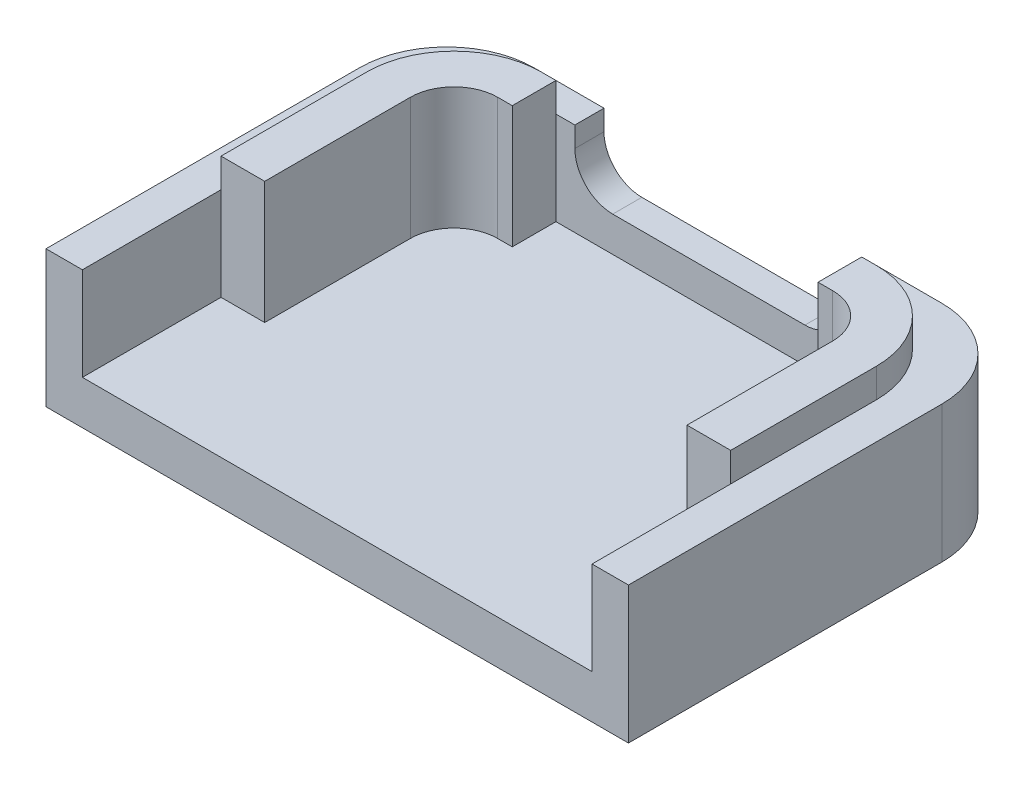
ISO-10303-21;
HEADER;
FILE_DESCRIPTION(('STEP AP214'),'2;1');
FILE_NAME('part.step','',(''),(''),'','','');
FILE_SCHEMA(('AUTOMOTIVE_DESIGN { 1 0 10303 214 1 1 1 1 }'));
ENDSEC;
DATA;
#1=APPLICATION_CONTEXT('core data for automotive mechanical design processes');
#2=APPLICATION_PROTOCOL_DEFINITION('international standard','automotive_design',2000,#1);
#3=PRODUCT_CONTEXT('',#1,'mechanical');
#4=PRODUCT('Part','Part','',(#3));
#5=PRODUCT_RELATED_PRODUCT_CATEGORY('part','',(#4));
#6=PRODUCT_DEFINITION_FORMATION('','',#4);
#7=PRODUCT_DEFINITION_CONTEXT('part definition',#1,'design');
#8=PRODUCT_DEFINITION('design','',#6,#7);
#9=PRODUCT_DEFINITION_SHAPE('','',#8);
#10=(LENGTH_UNIT() NAMED_UNIT(*) SI_UNIT(.MILLI.,.METRE.));
#11=(NAMED_UNIT(*) PLANE_ANGLE_UNIT() SI_UNIT($,.RADIAN.));
#12=(NAMED_UNIT(*) SI_UNIT($,.STERADIAN.) SOLID_ANGLE_UNIT());
#13=UNCERTAINTY_MEASURE_WITH_UNIT(LENGTH_MEASURE(1.E-05),#10,'distance_accuracy_value','');
#14=(GEOMETRIC_REPRESENTATION_CONTEXT(3) GLOBAL_UNCERTAINTY_ASSIGNED_CONTEXT((#13)) GLOBAL_UNIT_ASSIGNED_CONTEXT((#10,
#11,#12)) REPRESENTATION_CONTEXT('',''));
#15=CARTESIAN_POINT('',(0.,0.,0.));
#16=DIRECTION('',(0.,0.,1.));
#17=DIRECTION('',(1.,0.,0.));
#18=AXIS2_PLACEMENT_3D('',#15,#16,#17);
#19=CARTESIAN_POINT('',(1.49999999999999,3.2,-20.46));
#20=DIRECTION('',(0.,1.,0.));
#21=DIRECTION('',(0.,0.,1.));
#22=AXIS2_PLACEMENT_3D('',#19,#20,#21);
#23=PLANE('',#22);
#24=DIRECTION('',(0.,0.,-1.));
#25=VECTOR('',#24,1.);
#26=CARTESIAN_POINT('',(13.1,3.2,-20.46));
#27=LINE('',#26,#25);
#28=CARTESIAN_POINT('',(13.1,3.2,-22.46));
#29=VERTEX_POINT('',#28);
#30=CARTESIAN_POINT('',(13.1,3.2,-23.46));
#31=VERTEX_POINT('',#30);
#32=EDGE_CURVE('E11',#29,#31,#27,.T.);
#33=ORIENTED_EDGE('',*,*,#32,.F.);
#34=DIRECTION('',(1.,0.,0.));
#35=VECTOR('',#34,1.);
#36=CARTESIAN_POINT('',(2.74999999999999,3.2,-22.46));
#37=LINE('',#36,#35);
#38=CARTESIAN_POINT('',(13.75,3.2,-22.46));
#39=VERTEX_POINT('',#38);
#40=EDGE_CURVE('E486',#29,#39,#37,.T.);
#41=ORIENTED_EDGE('',*,*,#40,.T.);
#42=CARTESIAN_POINT('',(14.25,3.2,-22.46));
#43=VERTEX_POINT('',#42);
#44=EDGE_CURVE('E479',#39,#43,#37,.T.);
#45=ORIENTED_EDGE('',*,*,#44,.T.);
#46=CARTESIAN_POINT('',(14.25,3.2,-19.46));
#47=DIRECTION('',(0.,-1.,0.));
#48=DIRECTION('',(0.,0.,1.));
#49=AXIS2_PLACEMENT_3D('',#46,#47,#48);
#50=CIRCLE('',#49,3.);
#51=CARTESIAN_POINT('',(17.25,3.2,-19.46));
#52=VERTEX_POINT('',#51);
#53=EDGE_CURVE('E484',#43,#52,#50,.T.);
#54=ORIENTED_EDGE('',*,*,#53,.T.);
#55=DIRECTION('',(0.,0.,1.));
#56=VECTOR('',#55,1.);
#57=CARTESIAN_POINT('',(17.25,3.2,-19.46));
#58=LINE('',#57,#56);
#59=CARTESIAN_POINT('',(17.25,3.2,-14.46));
#60=VERTEX_POINT('',#59);
#61=EDGE_CURVE('E491',#52,#60,#58,.T.);
#62=ORIENTED_EDGE('',*,*,#61,.T.);
#63=CARTESIAN_POINT('',(17.25,3.2,-9.7));
#64=VERTEX_POINT('',#63);
#65=EDGE_CURVE('E490',#60,#64,#58,.T.);
#66=ORIENTED_EDGE('',*,*,#65,.T.);
#67=DIRECTION('',(1.,0.,0.));
#68=VECTOR('',#67,1.);
#69=CARTESIAN_POINT('',(18.5,3.2,-9.7));
#70=LINE('',#69,#68);
#71=CARTESIAN_POINT('',(18.5,3.2,-9.7));
#72=VERTEX_POINT('',#71);
#73=EDGE_CURVE('E495',#64,#72,#70,.T.);
#74=ORIENTED_EDGE('',*,*,#73,.T.);
#75=DIRECTION('',(0.,0.,-1.));
#76=VECTOR('',#75,1.);
#77=CARTESIAN_POINT('',(18.5,3.2,-20.46));
#78=LINE('',#77,#76);
#79=CARTESIAN_POINT('',(18.5,3.2,-20.46));
#80=VERTEX_POINT('',#79);
#81=EDGE_CURVE('E499',#72,#80,#78,.T.);
#82=ORIENTED_EDGE('',*,*,#81,.T.);
#83=CARTESIAN_POINT('',(15.5,3.2,-20.46));
#84=DIRECTION('',(0.,1.,0.));
#85=DIRECTION('',(0.,0.,-1.));
#86=AXIS2_PLACEMENT_3D('',#83,#84,#85);
#87=CIRCLE('',#86,3.);
#88=CARTESIAN_POINT('',(15.5,3.2,-23.46));
#89=VERTEX_POINT('',#88);
#90=EDGE_CURVE('E503',#80,#89,#87,.T.);
#91=ORIENTED_EDGE('',*,*,#90,.T.);
#92=DIRECTION('',(-1.,0.,0.));
#93=VECTOR('',#92,1.);
#94=CARTESIAN_POINT('',(1.50000000000001,3.2,-23.46));
#95=LINE('',#94,#93);
#96=EDGE_CURVE('E508',#89,#31,#95,.T.);
#97=ORIENTED_EDGE('',*,*,#96,.T.);
#98=EDGE_LOOP('',(#33,#41,#45,#54,#62,#66,#74,#82,#91,#97));
#99=FACE_BOUND('',#98,.T.);
#100=ADVANCED_FACE('F45',(#99),#23,.T.);
#101=CARTESIAN_POINT('',(15.5,0.,-20.46));
#102=DIRECTION('',(0.,-1.,0.));
#103=DIRECTION('',(0.,0.,-1.));
#104=AXIS2_PLACEMENT_3D('',#101,#102,#103);
#105=PLANE('',#104);
#106=DIRECTION('',(1.,0.,0.));
#107=VECTOR('',#106,1.);
#108=CARTESIAN_POINT('',(15.75,0.,-14.46));
#109=LINE('',#108,#107);
#110=CARTESIAN_POINT('',(15.75,0.,-14.46));
#111=VERTEX_POINT('',#110);
#112=CARTESIAN_POINT('',(17.25,0.,-14.46));
#113=VERTEX_POINT('',#112);
#114=EDGE_CURVE('E359',#111,#113,#109,.T.);
#115=ORIENTED_EDGE('',*,*,#114,.F.);
#116=DIRECTION('',(0.,0.,1.));
#117=VECTOR('',#116,1.);
#118=CARTESIAN_POINT('',(15.75,0.,-19.46));
#119=LINE('',#118,#117);
#120=CARTESIAN_POINT('',(15.75,0.,-19.46));
#121=VERTEX_POINT('',#120);
#122=EDGE_CURVE('E362',#121,#111,#119,.T.);
#123=ORIENTED_EDGE('',*,*,#122,.F.);
#124=CARTESIAN_POINT('',(14.25,0.,-19.46));
#125=DIRECTION('',(0.,-1.,0.));
#126=DIRECTION('',(0.,0.,1.));
#127=AXIS2_PLACEMENT_3D('',#124,#125,#126);
#128=CIRCLE('',#127,1.5);
#129=CARTESIAN_POINT('',(14.25,0.,-20.96));
#130=VERTEX_POINT('',#129);
#131=EDGE_CURVE('E365',#130,#121,#128,.T.);
#132=ORIENTED_EDGE('',*,*,#131,.F.);
#133=DIRECTION('',(1.,0.,0.));
#134=VECTOR('',#133,1.);
#135=CARTESIAN_POINT('',(13.75,0.,-20.96));
#136=LINE('',#135,#134);
#137=CARTESIAN_POINT('',(13.75,0.,-20.96));
#138=VERTEX_POINT('',#137);
#139=EDGE_CURVE('E352',#138,#130,#136,.T.);
#140=ORIENTED_EDGE('',*,*,#139,.F.);
#141=DIRECTION('',(0.,0.,1.));
#142=VECTOR('',#141,1.);
#143=CARTESIAN_POINT('',(13.75,0.,-20.96));
#144=LINE('',#143,#142);
#145=CARTESIAN_POINT('',(13.75,0.,-22.46));
#146=VERTEX_POINT('',#145);
#147=EDGE_CURVE('E355',#146,#138,#144,.T.);
#148=ORIENTED_EDGE('',*,*,#147,.F.);
#149=DIRECTION('',(1.,0.,0.));
#150=VECTOR('',#149,1.);
#151=CARTESIAN_POINT('',(2.74999999999999,0.,-22.46));
#152=LINE('',#151,#150);
#153=CARTESIAN_POINT('',(3.25,0.,-22.46));
#154=VERTEX_POINT('',#153);
#155=EDGE_CURVE('E523',#154,#146,#152,.T.);
#156=ORIENTED_EDGE('',*,*,#155,.F.);
#157=DIRECTION('',(0.,0.,-1.));
#158=VECTOR('',#157,1.);
#159=CARTESIAN_POINT('',(3.25,0.,-20.96));
#160=LINE('',#159,#158);
#161=CARTESIAN_POINT('',(3.25,0.,-20.96));
#162=VERTEX_POINT('',#161);
#163=EDGE_CURVE('E426',#162,#154,#160,.T.);
#164=ORIENTED_EDGE('',*,*,#163,.F.);
#165=DIRECTION('',(1.,0.,0.));
#166=VECTOR('',#165,1.);
#167=CARTESIAN_POINT('',(2.75,0.,-20.96));
#168=LINE('',#167,#166);
#169=CARTESIAN_POINT('',(2.75,0.,-20.96));
#170=VERTEX_POINT('',#169);
#171=EDGE_CURVE('E423',#170,#162,#168,.T.);
#172=ORIENTED_EDGE('',*,*,#171,.F.);
#173=CARTESIAN_POINT('',(2.75,0.,-19.46));
#174=DIRECTION('',(0.,-1.,0.));
#175=DIRECTION('',(0.,0.,-1.));
#176=AXIS2_PLACEMENT_3D('',#173,#174,#175);
#177=CIRCLE('',#176,1.5);
#178=CARTESIAN_POINT('',(1.25,0.,-19.46));
#179=VERTEX_POINT('',#178);
#180=EDGE_CURVE('E369',#179,#170,#177,.T.);
#181=ORIENTED_EDGE('',*,*,#180,.F.);
#182=DIRECTION('',(0.,0.,-1.));
#183=VECTOR('',#182,1.);
#184=CARTESIAN_POINT('',(1.25,0.,-19.46));
#185=LINE('',#184,#183);
#186=CARTESIAN_POINT('',(1.25,0.,-14.46));
#187=VERTEX_POINT('',#186);
#188=EDGE_CURVE('E398',#187,#179,#185,.T.);
#189=ORIENTED_EDGE('',*,*,#188,.F.);
#190=DIRECTION('',(1.,0.,0.));
#191=VECTOR('',#190,1.);
#192=CARTESIAN_POINT('',(-0.250000000000002,0.,-14.46));
#193=LINE('',#192,#191);
#194=CARTESIAN_POINT('',(-0.250000000000002,0.,-14.46));
#195=VERTEX_POINT('',#194);
#196=EDGE_CURVE('E429',#195,#187,#193,.T.);
#197=ORIENTED_EDGE('',*,*,#196,.F.);
#198=DIRECTION('',(0.,0.,-1.));
#199=VECTOR('',#198,1.);
#200=CARTESIAN_POINT('',(-0.250000000000006,0.,-19.46));
#201=LINE('',#200,#199);
#202=CARTESIAN_POINT('',(-0.250000000000006,0.,-9.7));
#203=VERTEX_POINT('',#202);
#204=EDGE_CURVE('E465',#203,#195,#201,.T.);
#205=ORIENTED_EDGE('',*,*,#204,.F.);
#206=DIRECTION('',(1.,0.,0.));
#207=VECTOR('',#206,1.);
#208=CARTESIAN_POINT('',(-1.50000000000001,0.,-9.7));
#209=LINE('',#208,#207);
#210=CARTESIAN_POINT('',(17.25,0.,-9.7));
#211=VERTEX_POINT('',#210);
#212=EDGE_CURVE('E536',#203,#211,#209,.T.);
#213=ORIENTED_EDGE('',*,*,#212,.T.);
#214=DIRECTION('',(0.,0.,1.));
#215=VECTOR('',#214,1.);
#216=CARTESIAN_POINT('',(17.25,0.,-19.46));
#217=LINE('',#216,#215);
#218=EDGE_CURVE('E69',#113,#211,#217,.T.);
#219=ORIENTED_EDGE('',*,*,#218,.F.);
#220=EDGE_LOOP('',(#115,#123,#132,#140,#148,#156,#164,#172,#181,#189,#197,#205,#213,#219));
#221=FACE_BOUND('',#220,.T.);
#222=ADVANCED_FACE('F620',(#221),#105,.F.);
#223=CARTESIAN_POINT('',(2.74999999999999,3.2,-22.46));
#224=DIRECTION('',(0.,0.,-1.));
#225=DIRECTION('',(-1.,0.,0.));
#226=AXIS2_PLACEMENT_3D('',#223,#224,#225);
#227=PLANE('',#226);
#228=ORIENTED_EDGE('',*,*,#40,.F.);
#229=DIRECTION('',(0.,-1.,0.));
#230=VECTOR('',#229,1.);
#231=CARTESIAN_POINT('',(13.1,3.2,-22.46));
#232=LINE('',#231,#230);
#233=CARTESIAN_POINT('',(13.1,2.5,-22.46));
#234=VERTEX_POINT('',#233);
#235=EDGE_CURVE('E306',#29,#234,#232,.T.);
#236=ORIENTED_EDGE('',*,*,#235,.T.);
#237=CARTESIAN_POINT('',(11.8,2.5,-22.46));
#238=DIRECTION('',(0.,0.,-1.));
#239=DIRECTION('',(-1.,0.,0.));
#240=AXIS2_PLACEMENT_3D('',#237,#238,#239);
#241=CIRCLE('',#240,1.3);
#242=CARTESIAN_POINT('',(11.8,1.2,-22.46));
#243=VERTEX_POINT('',#242);
#244=EDGE_CURVE('E264',#234,#243,#241,.T.);
#245=ORIENTED_EDGE('',*,*,#244,.T.);
#246=DIRECTION('',(-1.,0.,0.));
#247=VECTOR('',#246,1.);
#248=CARTESIAN_POINT('',(2.74999999999999,1.2,-22.46));
#249=LINE('',#248,#247);
#250=CARTESIAN_POINT('',(5.2,1.2,-22.46));
#251=VERTEX_POINT('',#250);
#252=EDGE_CURVE('E311',#243,#251,#249,.T.);
#253=ORIENTED_EDGE('',*,*,#252,.T.);
#254=CARTESIAN_POINT('',(5.2,2.5,-22.46));
#255=DIRECTION('',(0.,0.,-1.));
#256=DIRECTION('',(-1.,0.,0.));
#257=AXIS2_PLACEMENT_3D('',#254,#255,#256);
#258=CIRCLE('',#257,1.3);
#259=CARTESIAN_POINT('',(3.9,2.5,-22.46));
#260=VERTEX_POINT('',#259);
#261=EDGE_CURVE('E315',#251,#260,#258,.T.);
#262=ORIENTED_EDGE('',*,*,#261,.T.);
#263=DIRECTION('',(0.,1.,0.));
#264=VECTOR('',#263,1.);
#265=CARTESIAN_POINT('',(3.9,3.2,-22.46));
#266=LINE('',#265,#264);
#267=CARTESIAN_POINT('',(3.9,3.2,-22.46));
#268=VERTEX_POINT('',#267);
#269=EDGE_CURVE('E297',#260,#268,#266,.T.);
#270=ORIENTED_EDGE('',*,*,#269,.T.);
#271=CARTESIAN_POINT('',(3.25,3.2,-22.46));
#272=VERTEX_POINT('',#271);
#273=EDGE_CURVE('E485',#272,#268,#37,.T.);
#274=ORIENTED_EDGE('',*,*,#273,.F.);
#275=DIRECTION('',(0.,-1.,0.));
#276=VECTOR('',#275,1.);
#277=CARTESIAN_POINT('',(3.25,4.2,-22.46));
#278=LINE('',#277,#276);
#279=EDGE_CURVE('E453',#272,#154,#278,.T.);
#280=ORIENTED_EDGE('',*,*,#279,.T.);
#281=ORIENTED_EDGE('',*,*,#155,.T.);
#282=DIRECTION('',(0.,-1.,0.));
#283=VECTOR('',#282,1.);
#284=CARTESIAN_POINT('',(13.75,4.2,-22.46));
#285=LINE('',#284,#283);
#286=EDGE_CURVE('E338',#39,#146,#285,.T.);
#287=ORIENTED_EDGE('',*,*,#286,.F.);
#288=EDGE_LOOP('',(#228,#236,#245,#253,#262,#270,#274,#280,#281,#287));
#289=FACE_BOUND('',#288,.T.);
#290=ADVANCED_FACE('F590',(#289),#227,.F.);
#291=CARTESIAN_POINT('',(17.25,3.2,-19.46));
#292=DIRECTION('',(1.,0.,0.));
#293=DIRECTION('',(0.,0.,-1.));
#294=AXIS2_PLACEMENT_3D('',#291,#292,#293);
#295=PLANE('',#294);
#296=DIRECTION('',(0.,-1.,0.));
#297=VECTOR('',#296,1.);
#298=CARTESIAN_POINT('',(17.25,4.2,-14.46));
#299=LINE('',#298,#297);
#300=EDGE_CURVE('E326',#60,#113,#299,.T.);
#301=ORIENTED_EDGE('',*,*,#300,.T.);
#302=ORIENTED_EDGE('',*,*,#218,.T.);
#303=DIRECTION('',(0.,-1.,0.));
#304=VECTOR('',#303,1.);
#305=CARTESIAN_POINT('',(17.25,3.2,-9.7));
#306=LINE('',#305,#304);
#307=EDGE_CURVE('E519',#64,#211,#306,.T.);
#308=ORIENTED_EDGE('',*,*,#307,.F.);
#309=ORIENTED_EDGE('',*,*,#65,.F.);
#310=EDGE_LOOP('',(#301,#302,#308,#309));
#311=FACE_BOUND('',#310,.T.);
#312=ADVANCED_FACE('F615',(#311),#295,.F.);
#313=CARTESIAN_POINT('',(-0.250000000000006,3.2,-19.46));
#314=DIRECTION('',(-1.,0.,0.));
#315=DIRECTION('',(0.,0.,1.));
#316=AXIS2_PLACEMENT_3D('',#313,#314,#315);
#317=PLANE('',#316);
#318=DIRECTION('',(0.,-1.,0.));
#319=VECTOR('',#318,1.);
#320=CARTESIAN_POINT('',(-0.250000000000002,4.2,-14.46));
#321=LINE('',#320,#319);
#322=CARTESIAN_POINT('',(-0.250000000000002,3.2,-14.46));
#323=VERTEX_POINT('',#322);
#324=EDGE_CURVE('E441',#323,#195,#321,.T.);
#325=ORIENTED_EDGE('',*,*,#324,.F.);
#326=DIRECTION('',(0.,0.,-1.));
#327=VECTOR('',#326,1.);
#328=CARTESIAN_POINT('',(-0.250000000000006,3.2,-19.46));
#329=LINE('',#328,#327);
#330=CARTESIAN_POINT('',(-0.250000000000005,3.2,-9.7));
#331=VERTEX_POINT('',#330);
#332=EDGE_CURVE('E471',#331,#323,#329,.T.);
#333=ORIENTED_EDGE('',*,*,#332,.F.);
#334=DIRECTION('',(0.,-1.,0.));
#335=VECTOR('',#334,1.);
#336=CARTESIAN_POINT('',(-0.250000000000005,3.2,-9.7));
#337=LINE('',#336,#335);
#338=EDGE_CURVE('E532',#331,#203,#337,.T.);
#339=ORIENTED_EDGE('',*,*,#338,.T.);
#340=ORIENTED_EDGE('',*,*,#204,.T.);
#341=EDGE_LOOP('',(#325,#333,#339,#340));
#342=FACE_BOUND('',#341,.T.);
#343=ADVANCED_FACE('F651',(#342),#317,.F.);
#344=CARTESIAN_POINT('',(-1.50000000000001,-1.5,-9.7));
#345=DIRECTION('',(0.,0.,1.));
#346=DIRECTION('',(1.,0.,0.));
#347=AXIS2_PLACEMENT_3D('',#344,#345,#346);
#348=PLANE('',#347);
#349=ORIENTED_EDGE('',*,*,#212,.F.);
#350=ORIENTED_EDGE('',*,*,#338,.F.);
#351=DIRECTION('',(1.,0.,0.));
#352=VECTOR('',#351,1.);
#353=CARTESIAN_POINT('',(-0.250000000000005,3.2,-9.7));
#354=LINE('',#353,#352);
#355=CARTESIAN_POINT('',(-1.50000000000001,3.2,-9.7));
#356=VERTEX_POINT('',#355);
#357=EDGE_CURVE('E466',#356,#331,#354,.T.);
#358=ORIENTED_EDGE('',*,*,#357,.F.);
#359=DIRECTION('',(0.,1.,0.));
#360=VECTOR('',#359,1.);
#361=CARTESIAN_POINT('',(-1.50000000000001,-1.5,-9.7));
#362=LINE('',#361,#360);
#363=CARTESIAN_POINT('',(-1.50000000000001,-1.5,-9.7));
#364=VERTEX_POINT('',#363);
#365=EDGE_CURVE('E564',#364,#356,#362,.T.);
#366=ORIENTED_EDGE('',*,*,#365,.F.);
#367=DIRECTION('',(1.,0.,0.));
#368=VECTOR('',#367,1.);
#369=CARTESIAN_POINT('',(-1.50000000000001,-1.5,-9.7));
#370=LINE('',#369,#368);
#371=CARTESIAN_POINT('',(18.5,-1.5,-9.7));
#372=VERTEX_POINT('',#371);
#373=EDGE_CURVE('E537',#364,#372,#370,.T.);
#374=ORIENTED_EDGE('',*,*,#373,.T.);
#375=DIRECTION('',(0.,1.,0.));
#376=VECTOR('',#375,1.);
#377=CARTESIAN_POINT('',(18.5,-1.5,-9.7));
#378=LINE('',#377,#376);
#379=EDGE_CURVE('E561',#372,#72,#378,.T.);
#380=ORIENTED_EDGE('',*,*,#379,.T.);
#381=ORIENTED_EDGE('',*,*,#73,.F.);
#382=ORIENTED_EDGE('',*,*,#307,.T.);
#383=EDGE_LOOP('',(#349,#350,#358,#366,#374,#380,#381,#382));
#384=FACE_BOUND('',#383,.T.);
#385=ADVANCED_FACE('F47',(#384),#348,.T.);
#386=CARTESIAN_POINT('',(-1.50000000000001,-1.5,-20.46));
#387=DIRECTION('',(-1.,0.,0.));
#388=DIRECTION('',(0.,0.,1.));
#389=AXIS2_PLACEMENT_3D('',#386,#387,#388);
#390=PLANE('',#389);
#391=ORIENTED_EDGE('',*,*,#365,.T.);
#392=DIRECTION('',(0.,0.,1.));
#393=VECTOR('',#392,1.);
#394=CARTESIAN_POINT('',(-1.50000000000001,3.2,-20.46));
#395=LINE('',#394,#393);
#396=CARTESIAN_POINT('',(-1.50000000000001,3.2,-20.46));
#397=VERTEX_POINT('',#396);
#398=EDGE_CURVE('E515',#397,#356,#395,.T.);
#399=ORIENTED_EDGE('',*,*,#398,.F.);
#400=DIRECTION('',(0.,1.,0.));
#401=VECTOR('',#400,1.);
#402=CARTESIAN_POINT('',(-1.50000000000001,-1.5,-20.46));
#403=LINE('',#402,#401);
#404=CARTESIAN_POINT('',(-1.50000000000001,-1.5,-20.46));
#405=VERTEX_POINT('',#404);
#406=EDGE_CURVE('E567',#405,#397,#403,.T.);
#407=ORIENTED_EDGE('',*,*,#406,.F.);
#408=DIRECTION('',(0.,0.,1.));
#409=VECTOR('',#408,1.);
#410=CARTESIAN_POINT('',(-1.50000000000001,-1.5,-20.46));
#411=LINE('',#410,#409);
#412=EDGE_CURVE('E557',#405,#364,#411,.T.);
#413=ORIENTED_EDGE('',*,*,#412,.T.);
#414=EDGE_LOOP('',(#391,#399,#407,#413));
#415=FACE_BOUND('',#414,.T.);
#416=ADVANCED_FACE('F647',(#415),#390,.T.);
#417=CARTESIAN_POINT('',(1.49999999999999,-1.5,-20.46));
#418=DIRECTION('',(0.,1.,0.));
#419=DIRECTION('',(0.,0.,1.));
#420=AXIS2_PLACEMENT_3D('',#417,#418,#419);
#421=CYLINDRICAL_SURFACE('',#420,3.);
#422=ORIENTED_EDGE('',*,*,#406,.T.);
#423=CARTESIAN_POINT('',(1.49999999999999,3.2,-20.46));
#424=DIRECTION('',(0.,1.,0.));
#425=DIRECTION('',(0.,0.,1.));
#426=AXIS2_PLACEMENT_3D('',#423,#424,#425);
#427=CIRCLE('',#426,3.);
#428=CARTESIAN_POINT('',(1.50000000000001,3.2,-23.46));
#429=VERTEX_POINT('',#428);
#430=EDGE_CURVE('E511',#429,#397,#427,.T.);
#431=ORIENTED_EDGE('',*,*,#430,.F.);
#432=DIRECTION('',(0.,1.,0.));
#433=VECTOR('',#432,1.);
#434=CARTESIAN_POINT('',(1.50000000000001,-1.5,-23.46));
#435=LINE('',#434,#433);
#436=CARTESIAN_POINT('',(1.50000000000001,-1.5,-23.46));
#437=VERTEX_POINT('',#436);
#438=EDGE_CURVE('E570',#437,#429,#435,.T.);
#439=ORIENTED_EDGE('',*,*,#438,.F.);
#440=CARTESIAN_POINT('',(1.49999999999999,-1.5,-20.46));
#441=DIRECTION('',(0.,1.,0.));
#442=DIRECTION('',(0.,0.,1.));
#443=AXIS2_PLACEMENT_3D('',#440,#441,#442);
#444=CIRCLE('',#443,3.);
#445=EDGE_CURVE('E553',#437,#405,#444,.T.);
#446=ORIENTED_EDGE('',*,*,#445,.T.);
#447=EDGE_LOOP('',(#422,#431,#439,#446));
#448=FACE_BOUND('',#447,.T.);
#449=ADVANCED_FACE('F643',(#448),#421,.T.);
#450=CARTESIAN_POINT('',(1.50000000000001,-1.5,-23.46));
#451=DIRECTION('',(0.,0.,-1.));
#452=DIRECTION('',(-1.,0.,0.));
#453=AXIS2_PLACEMENT_3D('',#450,#451,#452);
#454=PLANE('',#453);
#455=DIRECTION('',(0.,-1.,0.));
#456=VECTOR('',#455,1.);
#457=CARTESIAN_POINT('',(13.1,3.2,-23.46));
#458=LINE('',#457,#456);
#459=CARTESIAN_POINT('',(13.1,2.5,-23.46));
#460=VERTEX_POINT('',#459);
#461=EDGE_CURVE('E271',#31,#460,#458,.T.);
#462=ORIENTED_EDGE('',*,*,#461,.F.);
#463=ORIENTED_EDGE('',*,*,#96,.F.);
#464=DIRECTION('',(0.,1.,0.));
#465=VECTOR('',#464,1.);
#466=CARTESIAN_POINT('',(15.5,-1.5,-23.46));
#467=LINE('',#466,#465);
#468=CARTESIAN_POINT('',(15.5,-1.5,-23.46));
#469=VERTEX_POINT('',#468);
#470=EDGE_CURVE('E574',#469,#89,#467,.T.);
#471=ORIENTED_EDGE('',*,*,#470,.F.);
#472=DIRECTION('',(-1.,0.,0.));
#473=VECTOR('',#472,1.);
#474=CARTESIAN_POINT('',(1.50000000000001,-1.5,-23.46));
#475=LINE('',#474,#473);
#476=EDGE_CURVE('E549',#469,#437,#475,.T.);
#477=ORIENTED_EDGE('',*,*,#476,.T.);
#478=ORIENTED_EDGE('',*,*,#438,.T.);
#479=CARTESIAN_POINT('',(3.9,3.2,-23.46));
#480=VERTEX_POINT('',#479);
#481=EDGE_CURVE('E507',#480,#429,#95,.T.);
#482=ORIENTED_EDGE('',*,*,#481,.F.);
#483=DIRECTION('',(0.,1.,0.));
#484=VECTOR('',#483,1.);
#485=CARTESIAN_POINT('',(3.9,3.2,-23.46));
#486=LINE('',#485,#484);
#487=CARTESIAN_POINT('',(3.9,2.5,-23.46));
#488=VERTEX_POINT('',#487);
#489=EDGE_CURVE('E61',#488,#480,#486,.T.);
#490=ORIENTED_EDGE('',*,*,#489,.F.);
#491=CARTESIAN_POINT('',(5.2,2.5,-23.46));
#492=DIRECTION('',(0.,0.,-1.));
#493=DIRECTION('',(-1.,0.,0.));
#494=AXIS2_PLACEMENT_3D('',#491,#492,#493);
#495=CIRCLE('',#494,1.3);
#496=CARTESIAN_POINT('',(5.2,1.2,-23.46));
#497=VERTEX_POINT('',#496);
#498=EDGE_CURVE('E286',#497,#488,#495,.T.);
#499=ORIENTED_EDGE('',*,*,#498,.F.);
#500=DIRECTION('',(-1.,0.,0.));
#501=VECTOR('',#500,1.);
#502=CARTESIAN_POINT('',(11.8,1.2,-23.46));
#503=LINE('',#502,#501);
#504=CARTESIAN_POINT('',(11.8,1.2,-23.46));
#505=VERTEX_POINT('',#504);
#506=EDGE_CURVE('E282',#505,#497,#503,.T.);
#507=ORIENTED_EDGE('',*,*,#506,.F.);
#508=CARTESIAN_POINT('',(11.8,2.5,-23.46));
#509=DIRECTION('',(0.,0.,-1.));
#510=DIRECTION('',(-1.,0.,0.));
#511=AXIS2_PLACEMENT_3D('',#508,#509,#510);
#512=CIRCLE('',#511,1.3);
#513=EDGE_CURVE('E261',#460,#505,#512,.T.);
#514=ORIENTED_EDGE('',*,*,#513,.F.);
#515=EDGE_LOOP('',(#462,#463,#471,#477,#478,#482,#490,#499,#507,#514));
#516=FACE_BOUND('',#515,.T.);
#517=ADVANCED_FACE('F279',(#516),#454,.T.);
#518=CARTESIAN_POINT('',(15.5,-1.5,-20.46));
#519=DIRECTION('',(0.,1.,0.));
#520=DIRECTION('',(0.,0.,1.));
#521=AXIS2_PLACEMENT_3D('',#518,#519,#520);
#522=CYLINDRICAL_SURFACE('',#521,3.);
#523=ORIENTED_EDGE('',*,*,#470,.T.);
#524=ORIENTED_EDGE('',*,*,#90,.F.);
#525=DIRECTION('',(0.,1.,0.));
#526=VECTOR('',#525,1.);
#527=CARTESIAN_POINT('',(18.5,-1.5,-20.46));
#528=LINE('',#527,#526);
#529=CARTESIAN_POINT('',(18.5,-1.5,-20.46));
#530=VERTEX_POINT('',#529);
#531=EDGE_CURVE('E577',#530,#80,#528,.T.);
#532=ORIENTED_EDGE('',*,*,#531,.F.);
#533=CARTESIAN_POINT('',(15.5,-1.5,-20.46));
#534=DIRECTION('',(0.,1.,0.));
#535=DIRECTION('',(0.,0.,-1.));
#536=AXIS2_PLACEMENT_3D('',#533,#534,#535);
#537=CIRCLE('',#536,3.);
#538=EDGE_CURVE('E545',#530,#469,#537,.T.);
#539=ORIENTED_EDGE('',*,*,#538,.T.);
#540=EDGE_LOOP('',(#523,#524,#532,#539));
#541=FACE_BOUND('',#540,.T.);
#542=ADVANCED_FACE('F634',(#541),#522,.T.);
#543=CARTESIAN_POINT('',(18.5,-1.5,-20.46));
#544=DIRECTION('',(1.,0.,0.));
#545=DIRECTION('',(0.,0.,-1.));
#546=AXIS2_PLACEMENT_3D('',#543,#544,#545);
#547=PLANE('',#546);
#548=ORIENTED_EDGE('',*,*,#531,.T.);
#549=ORIENTED_EDGE('',*,*,#81,.F.);
#550=ORIENTED_EDGE('',*,*,#379,.F.);
#551=DIRECTION('',(0.,0.,-1.));
#552=VECTOR('',#551,1.);
#553=CARTESIAN_POINT('',(18.5,-1.5,-20.46));
#554=LINE('',#553,#552);
#555=EDGE_CURVE('E541',#372,#530,#554,.T.);
#556=ORIENTED_EDGE('',*,*,#555,.T.);
#557=EDGE_LOOP('',(#548,#549,#550,#556));
#558=FACE_BOUND('',#557,.T.);
#559=ADVANCED_FACE('F630',(#558),#547,.T.);
#560=CARTESIAN_POINT('',(15.5,-1.5,-20.46));
#561=DIRECTION('',(0.,-1.,0.));
#562=DIRECTION('',(0.,0.,-1.));
#563=AXIS2_PLACEMENT_3D('',#560,#561,#562);
#564=PLANE('',#563);
#565=ORIENTED_EDGE('',*,*,#373,.F.);
#566=ORIENTED_EDGE('',*,*,#412,.F.);
#567=ORIENTED_EDGE('',*,*,#445,.F.);
#568=ORIENTED_EDGE('',*,*,#476,.F.);
#569=ORIENTED_EDGE('',*,*,#538,.F.);
#570=ORIENTED_EDGE('',*,*,#555,.F.);
#571=EDGE_LOOP('',(#565,#566,#567,#568,#569,#570));
#572=FACE_BOUND('',#571,.T.);
#573=ADVANCED_FACE('F638',(#572),#564,.T.);
#574=DIRECTION('',(0.,0.,1.));
#575=VECTOR('',#574,1.);
#576=CARTESIAN_POINT('',(3.9,3.2,-20.46));
#577=LINE('',#576,#575);
#578=EDGE_CURVE('E54',#480,#268,#577,.T.);
#579=ORIENTED_EDGE('',*,*,#578,.F.);
#580=ORIENTED_EDGE('',*,*,#481,.T.);
#581=ORIENTED_EDGE('',*,*,#430,.T.);
#582=ORIENTED_EDGE('',*,*,#398,.T.);
#583=ORIENTED_EDGE('',*,*,#357,.T.);
#584=ORIENTED_EDGE('',*,*,#332,.T.);
#585=CARTESIAN_POINT('',(-0.250000000000006,3.2,-19.46));
#586=VERTEX_POINT('',#585);
#587=EDGE_CURVE('E470',#323,#586,#329,.T.);
#588=ORIENTED_EDGE('',*,*,#587,.T.);
#589=CARTESIAN_POINT('',(2.74999999999999,3.2,-19.46));
#590=DIRECTION('',(0.,-1.,0.));
#591=DIRECTION('',(0.,0.,-1.));
#592=AXIS2_PLACEMENT_3D('',#589,#590,#591);
#593=CIRCLE('',#592,3.);
#594=CARTESIAN_POINT('',(2.75,3.2,-22.46));
#595=VERTEX_POINT('',#594);
#596=EDGE_CURVE('E475',#586,#595,#593,.T.);
#597=ORIENTED_EDGE('',*,*,#596,.T.);
#598=EDGE_CURVE('E480',#595,#272,#37,.T.);
#599=ORIENTED_EDGE('',*,*,#598,.T.);
#600=ORIENTED_EDGE('',*,*,#273,.T.);
#601=EDGE_LOOP('',(#579,#580,#581,#582,#583,#584,#588,#597,#599,#600));
#602=FACE_BOUND('',#601,.T.);
#603=ADVANCED_FACE('F592',(#602),#23,.T.);
#604=CARTESIAN_POINT('',(2.75,4.2,-19.46));
#605=DIRECTION('',(0.,-1.,0.));
#606=DIRECTION('',(0.,0.,-1.));
#607=AXIS2_PLACEMENT_3D('',#604,#605,#606);
#608=CYLINDRICAL_SURFACE('',#607,1.5);
#609=ORIENTED_EDGE('',*,*,#180,.T.);
#610=DIRECTION('',(0.,-1.,0.));
#611=VECTOR('',#610,1.);
#612=CARTESIAN_POINT('',(2.75,4.2,-20.96));
#613=LINE('',#612,#611);
#614=CARTESIAN_POINT('',(2.75,4.2,-20.96));
#615=VERTEX_POINT('',#614);
#616=EDGE_CURVE('E462',#615,#170,#613,.T.);
#617=ORIENTED_EDGE('',*,*,#616,.F.);
#618=CARTESIAN_POINT('',(2.75,4.2,-19.46));
#619=DIRECTION('',(0.,-1.,0.));
#620=DIRECTION('',(0.,0.,-1.));
#621=AXIS2_PLACEMENT_3D('',#618,#619,#620);
#622=CIRCLE('',#621,1.5);
#623=CARTESIAN_POINT('',(1.25,4.2,-19.46));
#624=VERTEX_POINT('',#623);
#625=EDGE_CURVE('E393',#624,#615,#622,.T.);
#626=ORIENTED_EDGE('',*,*,#625,.F.);
#627=DIRECTION('',(0.,-1.,0.));
#628=VECTOR('',#627,1.);
#629=CARTESIAN_POINT('',(1.25,4.2,-19.46));
#630=LINE('',#629,#628);
#631=EDGE_CURVE('E419',#624,#179,#630,.T.);
#632=ORIENTED_EDGE('',*,*,#631,.T.);
#633=EDGE_LOOP('',(#609,#617,#626,#632));
#634=FACE_BOUND('',#633,.T.);
#635=ADVANCED_FACE('F707',(#634),#608,.F.);
#636=CARTESIAN_POINT('',(2.75,4.2,-20.96));
#637=DIRECTION('',(0.,0.,-1.));
#638=DIRECTION('',(-1.,0.,0.));
#639=AXIS2_PLACEMENT_3D('',#636,#637,#638);
#640=PLANE('',#639);
#641=ORIENTED_EDGE('',*,*,#171,.T.);
#642=DIRECTION('',(0.,-1.,0.));
#643=VECTOR('',#642,1.);
#644=CARTESIAN_POINT('',(3.25,4.2,-20.96));
#645=LINE('',#644,#643);
#646=CARTESIAN_POINT('',(3.25,4.2,-20.96));
#647=VERTEX_POINT('',#646);
#648=EDGE_CURVE('E458',#647,#162,#645,.T.);
#649=ORIENTED_EDGE('',*,*,#648,.F.);
#650=DIRECTION('',(1.,0.,0.));
#651=VECTOR('',#650,1.);
#652=CARTESIAN_POINT('',(2.75,4.2,-20.96));
#653=LINE('',#652,#651);
#654=EDGE_CURVE('E397',#615,#647,#653,.T.);
#655=ORIENTED_EDGE('',*,*,#654,.F.);
#656=ORIENTED_EDGE('',*,*,#616,.T.);
#657=EDGE_LOOP('',(#641,#649,#655,#656));
#658=FACE_BOUND('',#657,.T.);
#659=ADVANCED_FACE('F713',(#658),#640,.F.);
#660=CARTESIAN_POINT('',(3.25,4.2,-20.96));
#661=DIRECTION('',(-1.,0.,0.));
#662=DIRECTION('',(0.,0.,1.));
#663=AXIS2_PLACEMENT_3D('',#660,#661,#662);
#664=PLANE('',#663);
#665=ORIENTED_EDGE('',*,*,#163,.T.);
#666=ORIENTED_EDGE('',*,*,#279,.F.);
#667=CARTESIAN_POINT('',(3.25,4.2,-22.46));
#668=VERTEX_POINT('',#667);
#669=EDGE_CURVE('E454',#668,#272,#278,.T.);
#670=ORIENTED_EDGE('',*,*,#669,.F.);
#671=DIRECTION('',(0.,0.,-1.));
#672=VECTOR('',#671,1.);
#673=CARTESIAN_POINT('',(3.25,4.2,-20.96));
#674=LINE('',#673,#672);
#675=EDGE_CURVE('E401',#647,#668,#674,.T.);
#676=ORIENTED_EDGE('',*,*,#675,.F.);
#677=ORIENTED_EDGE('',*,*,#648,.T.);
#678=EDGE_LOOP('',(#665,#666,#670,#676,#677));
#679=FACE_BOUND('',#678,.T.);
#680=ADVANCED_FACE('F768',(#679),#664,.F.);
#681=CARTESIAN_POINT('',(2.75,4.2,-22.46));
#682=DIRECTION('',(0.,0.,1.));
#683=DIRECTION('',(1.,0.,0.));
#684=AXIS2_PLACEMENT_3D('',#681,#682,#683);
#685=PLANE('',#684);
#686=ORIENTED_EDGE('',*,*,#598,.F.);
#687=DIRECTION('',(0.,-1.,0.));
#688=VECTOR('',#687,1.);
#689=CARTESIAN_POINT('',(2.75,4.2,-22.46));
#690=LINE('',#689,#688);
#691=CARTESIAN_POINT('',(2.75,4.2,-22.46));
#692=VERTEX_POINT('',#691);
#693=EDGE_CURVE('E449',#692,#595,#690,.T.);
#694=ORIENTED_EDGE('',*,*,#693,.F.);
#695=DIRECTION('',(-1.,0.,0.));
#696=VECTOR('',#695,1.);
#697=CARTESIAN_POINT('',(2.75,4.2,-22.46));
#698=LINE('',#697,#696);
#699=EDGE_CURVE('E404',#668,#692,#698,.T.);
#700=ORIENTED_EDGE('',*,*,#699,.F.);
#701=ORIENTED_EDGE('',*,*,#669,.T.);
#702=EDGE_LOOP('',(#686,#694,#700,#701));
#703=FACE_BOUND('',#702,.T.);
#704=ADVANCED_FACE('F777',(#703),#685,.F.);
#705=CARTESIAN_POINT('',(2.75,4.2,-19.46));
#706=DIRECTION('',(0.,-1.,0.));
#707=DIRECTION('',(0.,0.,-1.));
#708=AXIS2_PLACEMENT_3D('',#705,#706,#707);
#709=CYLINDRICAL_SURFACE('',#708,3.);
#710=ORIENTED_EDGE('',*,*,#596,.F.);
#711=DIRECTION('',(0.,-1.,0.));
#712=VECTOR('',#711,1.);
#713=CARTESIAN_POINT('',(-0.250000000000002,4.2,-19.46));
#714=LINE('',#713,#712);
#715=CARTESIAN_POINT('',(-0.250000000000002,4.2,-19.46));
#716=VERTEX_POINT('',#715);
#717=EDGE_CURVE('E446',#716,#586,#714,.T.);
#718=ORIENTED_EDGE('',*,*,#717,.F.);
#719=CARTESIAN_POINT('',(2.75,4.2,-19.46));
#720=DIRECTION('',(0.,1.,0.));
#721=DIRECTION('',(0.,0.,-1.));
#722=AXIS2_PLACEMENT_3D('',#719,#720,#721);
#723=CIRCLE('',#722,3.);
#724=EDGE_CURVE('E407',#692,#716,#723,.T.);
#725=ORIENTED_EDGE('',*,*,#724,.F.);
#726=ORIENTED_EDGE('',*,*,#693,.T.);
#727=EDGE_LOOP('',(#710,#718,#725,#726));
#728=FACE_BOUND('',#727,.T.);
#729=ADVANCED_FACE('F785',(#728),#709,.T.);
#730=CARTESIAN_POINT('',(-0.250000000000002,4.2,-19.46));
#731=DIRECTION('',(1.,0.,0.));
#732=DIRECTION('',(0.,0.,-1.));
#733=AXIS2_PLACEMENT_3D('',#730,#731,#732);
#734=PLANE('',#733);
#735=ORIENTED_EDGE('',*,*,#587,.F.);
#736=CARTESIAN_POINT('',(-0.250000000000002,4.2,-14.46));
#737=VERTEX_POINT('',#736);
#738=EDGE_CURVE('E442',#737,#323,#321,.T.);
#739=ORIENTED_EDGE('',*,*,#738,.F.);
#740=DIRECTION('',(0.,0.,1.));
#741=VECTOR('',#740,1.);
#742=CARTESIAN_POINT('',(-0.250000000000002,4.2,-19.46));
#743=LINE('',#742,#741);
#744=EDGE_CURVE('E410',#716,#737,#743,.T.);
#745=ORIENTED_EDGE('',*,*,#744,.F.);
#746=ORIENTED_EDGE('',*,*,#717,.T.);
#747=EDGE_LOOP('',(#735,#739,#745,#746));
#748=FACE_BOUND('',#747,.T.);
#749=ADVANCED_FACE('F794',(#748),#734,.F.);
#750=CARTESIAN_POINT('',(-0.250000000000002,4.2,-14.46));
#751=DIRECTION('',(0.,0.,-1.));
#752=DIRECTION('',(-1.,0.,0.));
#753=AXIS2_PLACEMENT_3D('',#750,#751,#752);
#754=PLANE('',#753);
#755=ORIENTED_EDGE('',*,*,#196,.T.);
#756=DIRECTION('',(0.,-1.,0.));
#757=VECTOR('',#756,1.);
#758=CARTESIAN_POINT('',(1.25,4.2,-14.46));
#759=LINE('',#758,#757);
#760=CARTESIAN_POINT('',(1.25,4.2,-14.46));
#761=VERTEX_POINT('',#760);
#762=EDGE_CURVE('E437',#761,#187,#759,.T.);
#763=ORIENTED_EDGE('',*,*,#762,.F.);
#764=DIRECTION('',(1.,0.,0.));
#765=VECTOR('',#764,1.);
#766=CARTESIAN_POINT('',(-0.250000000000002,4.2,-14.46));
#767=LINE('',#766,#765);
#768=EDGE_CURVE('E413',#737,#761,#767,.T.);
#769=ORIENTED_EDGE('',*,*,#768,.F.);
#770=ORIENTED_EDGE('',*,*,#738,.T.);
#771=ORIENTED_EDGE('',*,*,#324,.T.);
#772=EDGE_LOOP('',(#755,#763,#769,#770,#771));
#773=FACE_BOUND('',#772,.T.);
#774=ADVANCED_FACE('F803',(#773),#754,.F.);
#775=CARTESIAN_POINT('',(1.25,4.2,-19.46));
#776=DIRECTION('',(-1.,0.,0.));
#777=DIRECTION('',(0.,0.,1.));
#778=AXIS2_PLACEMENT_3D('',#775,#776,#777);
#779=PLANE('',#778);
#780=ORIENTED_EDGE('',*,*,#188,.T.);
#781=ORIENTED_EDGE('',*,*,#631,.F.);
#782=DIRECTION('',(0.,0.,-1.));
#783=VECTOR('',#782,1.);
#784=CARTESIAN_POINT('',(1.25,4.2,-19.46));
#785=LINE('',#784,#783);
#786=EDGE_CURVE('E416',#761,#624,#785,.T.);
#787=ORIENTED_EDGE('',*,*,#786,.F.);
#788=ORIENTED_EDGE('',*,*,#762,.T.);
#789=EDGE_LOOP('',(#780,#781,#787,#788));
#790=FACE_BOUND('',#789,.T.);
#791=ADVANCED_FACE('F692',(#790),#779,.F.);
#792=CARTESIAN_POINT('',(2.75,4.2,-19.46));
#793=DIRECTION('',(0.,-1.,0.));
#794=DIRECTION('',(0.,0.,-1.));
#795=AXIS2_PLACEMENT_3D('',#792,#793,#794);
#796=PLANE('',#795);
#797=ORIENTED_EDGE('',*,*,#625,.T.);
#798=ORIENTED_EDGE('',*,*,#654,.T.);
#799=ORIENTED_EDGE('',*,*,#675,.T.);
#800=ORIENTED_EDGE('',*,*,#699,.T.);
#801=ORIENTED_EDGE('',*,*,#724,.T.);
#802=ORIENTED_EDGE('',*,*,#744,.T.);
#803=ORIENTED_EDGE('',*,*,#768,.T.);
#804=ORIENTED_EDGE('',*,*,#786,.T.);
#805=EDGE_LOOP('',(#797,#798,#799,#800,#801,#802,#803,#804));
#806=FACE_BOUND('',#805,.T.);
#807=ADVANCED_FACE('F685',(#806),#796,.F.);
#808=CARTESIAN_POINT('',(14.25,4.2,-19.46));
#809=DIRECTION('',(0.,-1.,0.));
#810=DIRECTION('',(0.,0.,-1.));
#811=AXIS2_PLACEMENT_3D('',#808,#809,#810);
#812=CYLINDRICAL_SURFACE('',#811,1.5);
#813=ORIENTED_EDGE('',*,*,#131,.T.);
#814=DIRECTION('',(0.,-1.,0.));
#815=VECTOR('',#814,1.);
#816=CARTESIAN_POINT('',(15.75,4.2,-19.46));
#817=LINE('',#816,#815);
#818=CARTESIAN_POINT('',(15.75,4.2,-19.46));
#819=VERTEX_POINT('',#818);
#820=EDGE_CURVE('E319',#819,#121,#817,.T.);
#821=ORIENTED_EDGE('',*,*,#820,.F.);
#822=CARTESIAN_POINT('',(14.25,4.2,-19.46));
#823=DIRECTION('',(0.,-1.,0.));
#824=DIRECTION('',(0.,0.,1.));
#825=AXIS2_PLACEMENT_3D('',#822,#823,#824);
#826=CIRCLE('',#825,1.5);
#827=CARTESIAN_POINT('',(14.25,4.2,-20.96));
#828=VERTEX_POINT('',#827);
#829=EDGE_CURVE('E356',#828,#819,#826,.T.);
#830=ORIENTED_EDGE('',*,*,#829,.F.);
#831=DIRECTION('',(0.,-1.,0.));
#832=VECTOR('',#831,1.);
#833=CARTESIAN_POINT('',(14.25,4.2,-20.96));
#834=LINE('',#833,#832);
#835=EDGE_CURVE('E347',#828,#130,#834,.T.);
#836=ORIENTED_EDGE('',*,*,#835,.T.);
#837=EDGE_LOOP('',(#813,#821,#830,#836));
#838=FACE_BOUND('',#837,.T.);
#839=ADVANCED_FACE('F683',(#838),#812,.F.);
#840=CARTESIAN_POINT('',(15.75,4.2,-19.46));
#841=DIRECTION('',(1.,0.,0.));
#842=DIRECTION('',(0.,0.,-1.));
#843=AXIS2_PLACEMENT_3D('',#840,#841,#842);
#844=PLANE('',#843);
#845=ORIENTED_EDGE('',*,*,#122,.T.);
#846=DIRECTION('',(0.,-1.,0.));
#847=VECTOR('',#846,1.);
#848=CARTESIAN_POINT('',(15.75,4.2,-14.46));
#849=LINE('',#848,#847);
#850=CARTESIAN_POINT('',(15.75,4.2,-14.46));
#851=VERTEX_POINT('',#850);
#852=EDGE_CURVE('E322',#851,#111,#849,.T.);
#853=ORIENTED_EDGE('',*,*,#852,.F.);
#854=DIRECTION('',(0.,0.,1.));
#855=VECTOR('',#854,1.);
#856=CARTESIAN_POINT('',(15.75,4.2,-19.46));
#857=LINE('',#856,#855);
#858=EDGE_CURVE('E387',#819,#851,#857,.T.);
#859=ORIENTED_EDGE('',*,*,#858,.F.);
#860=ORIENTED_EDGE('',*,*,#820,.T.);
#861=EDGE_LOOP('',(#845,#853,#859,#860));
#862=FACE_BOUND('',#861,.T.);
#863=ADVANCED_FACE('F681',(#862),#844,.F.);
#864=CARTESIAN_POINT('',(15.75,4.2,-14.46));
#865=DIRECTION('',(0.,0.,-1.));
#866=DIRECTION('',(-1.,0.,0.));
#867=AXIS2_PLACEMENT_3D('',#864,#865,#866);
#868=PLANE('',#867);
#869=ORIENTED_EDGE('',*,*,#114,.T.);
#870=ORIENTED_EDGE('',*,*,#300,.F.);
#871=CARTESIAN_POINT('',(17.25,4.2,-14.46));
#872=VERTEX_POINT('',#871);
#873=EDGE_CURVE('E327',#872,#60,#299,.T.);
#874=ORIENTED_EDGE('',*,*,#873,.F.);
#875=DIRECTION('',(1.,0.,0.));
#876=VECTOR('',#875,1.);
#877=CARTESIAN_POINT('',(15.75,4.2,-14.46));
#878=LINE('',#877,#876);
#879=EDGE_CURVE('E384',#851,#872,#878,.T.);
#880=ORIENTED_EDGE('',*,*,#879,.F.);
#881=ORIENTED_EDGE('',*,*,#852,.T.);
#882=EDGE_LOOP('',(#869,#870,#874,#880,#881));
#883=FACE_BOUND('',#882,.T.);
#884=ADVANCED_FACE('F678',(#883),#868,.F.);
#885=CARTESIAN_POINT('',(17.25,4.2,-19.46));
#886=DIRECTION('',(-1.,0.,0.));
#887=DIRECTION('',(0.,0.,1.));
#888=AXIS2_PLACEMENT_3D('',#885,#886,#887);
#889=PLANE('',#888);
#890=ORIENTED_EDGE('',*,*,#61,.F.);
#891=DIRECTION('',(0.,-1.,0.));
#892=VECTOR('',#891,1.);
#893=CARTESIAN_POINT('',(17.25,4.2,-19.46));
#894=LINE('',#893,#892);
#895=CARTESIAN_POINT('',(17.25,4.2,-19.46));
#896=VERTEX_POINT('',#895);
#897=EDGE_CURVE('E331',#896,#52,#894,.T.);
#898=ORIENTED_EDGE('',*,*,#897,.F.);
#899=DIRECTION('',(0.,0.,-1.));
#900=VECTOR('',#899,1.);
#901=CARTESIAN_POINT('',(17.25,4.2,-19.46));
#902=LINE('',#901,#900);
#903=EDGE_CURVE('E381',#872,#896,#902,.T.);
#904=ORIENTED_EDGE('',*,*,#903,.F.);
#905=ORIENTED_EDGE('',*,*,#873,.T.);
#906=EDGE_LOOP('',(#890,#898,#904,#905));
#907=FACE_BOUND('',#906,.T.);
#908=ADVANCED_FACE('F676',(#907),#889,.F.);
#909=CARTESIAN_POINT('',(14.25,4.2,-19.46));
#910=DIRECTION('',(0.,-1.,0.));
#911=DIRECTION('',(0.,0.,-1.));
#912=AXIS2_PLACEMENT_3D('',#909,#910,#911);
#913=CYLINDRICAL_SURFACE('',#912,3.);
#914=ORIENTED_EDGE('',*,*,#53,.F.);
#915=DIRECTION('',(0.,-1.,0.));
#916=VECTOR('',#915,1.);
#917=CARTESIAN_POINT('',(14.25,4.2,-22.46));
#918=LINE('',#917,#916);
#919=CARTESIAN_POINT('',(14.25,4.2,-22.46));
#920=VERTEX_POINT('',#919);
#921=EDGE_CURVE('E335',#920,#43,#918,.T.);
#922=ORIENTED_EDGE('',*,*,#921,.F.);
#923=CARTESIAN_POINT('',(14.25,4.2,-19.46));
#924=DIRECTION('',(0.,1.,0.));
#925=DIRECTION('',(0.,0.,1.));
#926=AXIS2_PLACEMENT_3D('',#923,#924,#925);
#927=CIRCLE('',#926,3.);
#928=EDGE_CURVE('E378',#896,#920,#927,.T.);
#929=ORIENTED_EDGE('',*,*,#928,.F.);
#930=ORIENTED_EDGE('',*,*,#897,.T.);
#931=EDGE_LOOP('',(#914,#922,#929,#930));
#932=FACE_BOUND('',#931,.T.);
#933=ADVANCED_FACE('F674',(#932),#913,.T.);
#934=CARTESIAN_POINT('',(13.75,4.2,-22.46));
#935=DIRECTION('',(0.,0.,1.));
#936=DIRECTION('',(1.,0.,0.));
#937=AXIS2_PLACEMENT_3D('',#934,#935,#936);
#938=PLANE('',#937);
#939=ORIENTED_EDGE('',*,*,#44,.F.);
#940=CARTESIAN_POINT('',(13.75,4.2,-22.46));
#941=VERTEX_POINT('',#940);
#942=EDGE_CURVE('E339',#941,#39,#285,.T.);
#943=ORIENTED_EDGE('',*,*,#942,.F.);
#944=DIRECTION('',(-1.,0.,0.));
#945=VECTOR('',#944,1.);
#946=CARTESIAN_POINT('',(13.75,4.2,-22.46));
#947=LINE('',#946,#945);
#948=EDGE_CURVE('E375',#920,#941,#947,.T.);
#949=ORIENTED_EDGE('',*,*,#948,.F.);
#950=ORIENTED_EDGE('',*,*,#921,.T.);
#951=EDGE_LOOP('',(#939,#943,#949,#950));
#952=FACE_BOUND('',#951,.T.);
#953=ADVANCED_FACE('F602',(#952),#938,.F.);
#954=CARTESIAN_POINT('',(13.75,4.2,-20.96));
#955=DIRECTION('',(1.,0.,0.));
#956=DIRECTION('',(0.,0.,-1.));
#957=AXIS2_PLACEMENT_3D('',#954,#955,#956);
#958=PLANE('',#957);
#959=ORIENTED_EDGE('',*,*,#147,.T.);
#960=DIRECTION('',(0.,-1.,0.));
#961=VECTOR('',#960,1.);
#962=CARTESIAN_POINT('',(13.75,4.2,-20.96));
#963=LINE('',#962,#961);
#964=CARTESIAN_POINT('',(13.75,4.2,-20.96));
#965=VERTEX_POINT('',#964);
#966=EDGE_CURVE('E343',#965,#138,#963,.T.);
#967=ORIENTED_EDGE('',*,*,#966,.F.);
#968=DIRECTION('',(0.,0.,1.));
#969=VECTOR('',#968,1.);
#970=CARTESIAN_POINT('',(13.75,4.2,-20.96));
#971=LINE('',#970,#969);
#972=EDGE_CURVE('E372',#941,#965,#971,.T.);
#973=ORIENTED_EDGE('',*,*,#972,.F.);
#974=ORIENTED_EDGE('',*,*,#942,.T.);
#975=ORIENTED_EDGE('',*,*,#286,.T.);
#976=EDGE_LOOP('',(#959,#967,#973,#974,#975));
#977=FACE_BOUND('',#976,.T.);
#978=ADVANCED_FACE('F608',(#977),#958,.F.);
#979=CARTESIAN_POINT('',(13.75,4.2,-20.96));
#980=DIRECTION('',(0.,0.,-1.));
#981=DIRECTION('',(-1.,0.,0.));
#982=AXIS2_PLACEMENT_3D('',#979,#980,#981);
#983=PLANE('',#982);
#984=ORIENTED_EDGE('',*,*,#139,.T.);
#985=ORIENTED_EDGE('',*,*,#835,.F.);
#986=DIRECTION('',(1.,0.,0.));
#987=VECTOR('',#986,1.);
#988=CARTESIAN_POINT('',(13.75,4.2,-20.96));
#989=LINE('',#988,#987);
#990=EDGE_CURVE('E351',#965,#828,#989,.T.);
#991=ORIENTED_EDGE('',*,*,#990,.F.);
#992=ORIENTED_EDGE('',*,*,#966,.T.);
#993=EDGE_LOOP('',(#984,#985,#991,#992));
#994=FACE_BOUND('',#993,.T.);
#995=ADVANCED_FACE('F664',(#994),#983,.F.);
#996=CARTESIAN_POINT('',(14.25,4.2,-19.46));
#997=DIRECTION('',(0.,1.,0.));
#998=DIRECTION('',(0.,0.,1.));
#999=AXIS2_PLACEMENT_3D('',#996,#997,#998);
#1000=PLANE('',#999);
#1001=ORIENTED_EDGE('',*,*,#829,.T.);
#1002=ORIENTED_EDGE('',*,*,#858,.T.);
#1003=ORIENTED_EDGE('',*,*,#879,.T.);
#1004=ORIENTED_EDGE('',*,*,#903,.T.);
#1005=ORIENTED_EDGE('',*,*,#928,.T.);
#1006=ORIENTED_EDGE('',*,*,#948,.T.);
#1007=ORIENTED_EDGE('',*,*,#972,.T.);
#1008=ORIENTED_EDGE('',*,*,#990,.T.);
#1009=EDGE_LOOP('',(#1001,#1002,#1003,#1004,#1005,#1006,#1007,#1008));
#1010=FACE_BOUND('',#1009,.T.);
#1011=ADVANCED_FACE('F668',(#1010),#1000,.T.);
#1012=CARTESIAN_POINT('',(5.2,2.5,-9.7));
#1013=DIRECTION('',(0.,0.,-1.));
#1014=DIRECTION('',(-1.,0.,0.));
#1015=AXIS2_PLACEMENT_3D('',#1012,#1013,#1014);
#1016=CYLINDRICAL_SURFACE('',#1015,1.3);
#1017=DIRECTION('',(0.,0.,-1.));
#1018=VECTOR('',#1017,1.);
#1019=CARTESIAN_POINT('',(5.2,1.2,-9.7));
#1020=LINE('',#1019,#1018);
#1021=EDGE_CURVE('E298',#251,#497,#1020,.T.);
#1022=ORIENTED_EDGE('',*,*,#1021,.T.);
#1023=ORIENTED_EDGE('',*,*,#498,.T.);
#1024=DIRECTION('',(0.,0.,-1.));
#1025=VECTOR('',#1024,1.);
#1026=CARTESIAN_POINT('',(3.9,2.5,-9.7));
#1027=LINE('',#1026,#1025);
#1028=EDGE_CURVE('E294',#260,#488,#1027,.T.);
#1029=ORIENTED_EDGE('',*,*,#1028,.F.);
#1030=ORIENTED_EDGE('',*,*,#261,.F.);
#1031=EDGE_LOOP('',(#1022,#1023,#1029,#1030));
#1032=FACE_BOUND('',#1031,.T.);
#1033=ADVANCED_FACE('F892',(#1032),#1016,.F.);
#1034=CARTESIAN_POINT('',(11.8,1.2,-9.7));
#1035=DIRECTION('',(0.,-1.,0.));
#1036=DIRECTION('',(1.,0.,0.));
#1037=AXIS2_PLACEMENT_3D('',#1034,#1035,#1036);
#1038=PLANE('',#1037);
#1039=DIRECTION('',(0.,0.,-1.));
#1040=VECTOR('',#1039,1.);
#1041=CARTESIAN_POINT('',(11.8,1.2,-9.7));
#1042=LINE('',#1041,#1040);
#1043=EDGE_CURVE('E268',#243,#505,#1042,.T.);
#1044=ORIENTED_EDGE('',*,*,#1043,.T.);
#1045=ORIENTED_EDGE('',*,*,#506,.T.);
#1046=ORIENTED_EDGE('',*,*,#1021,.F.);
#1047=ORIENTED_EDGE('',*,*,#252,.F.);
#1048=EDGE_LOOP('',(#1044,#1045,#1046,#1047));
#1049=FACE_BOUND('',#1048,.T.);
#1050=ADVANCED_FACE('F904',(#1049),#1038,.F.);
#1051=CARTESIAN_POINT('',(11.8,2.5,-9.7));
#1052=DIRECTION('',(0.,0.,-1.));
#1053=DIRECTION('',(-1.,0.,0.));
#1054=AXIS2_PLACEMENT_3D('',#1051,#1052,#1053);
#1055=CYLINDRICAL_SURFACE('',#1054,1.3);
#1056=DIRECTION('',(0.,0.,-1.));
#1057=VECTOR('',#1056,1.);
#1058=CARTESIAN_POINT('',(13.1,2.5,-9.7));
#1059=LINE('',#1058,#1057);
#1060=EDGE_CURVE('E256',#234,#460,#1059,.T.);
#1061=ORIENTED_EDGE('',*,*,#1060,.T.);
#1062=ORIENTED_EDGE('',*,*,#513,.T.);
#1063=ORIENTED_EDGE('',*,*,#1043,.F.);
#1064=ORIENTED_EDGE('',*,*,#244,.F.);
#1065=EDGE_LOOP('',(#1061,#1062,#1063,#1064));
#1066=FACE_BOUND('',#1065,.T.);
#1067=ADVANCED_FACE('F258',(#1066),#1055,.F.);
#1068=CARTESIAN_POINT('',(13.1,3.2,-9.7));
#1069=DIRECTION('',(1.,0.,0.));
#1070=DIRECTION('',(0.,0.,-1.));
#1071=AXIS2_PLACEMENT_3D('',#1068,#1069,#1070);
#1072=PLANE('',#1071);
#1073=ORIENTED_EDGE('',*,*,#32,.T.);
#1074=ORIENTED_EDGE('',*,*,#461,.T.);
#1075=ORIENTED_EDGE('',*,*,#1060,.F.);
#1076=ORIENTED_EDGE('',*,*,#235,.F.);
#1077=EDGE_LOOP('',(#1073,#1074,#1075,#1076));
#1078=FACE_BOUND('',#1077,.T.);
#1079=ADVANCED_FACE('F272',(#1078),#1072,.F.);
#1080=CARTESIAN_POINT('',(3.9,3.2,-9.7));
#1081=DIRECTION('',(-1.,0.,0.));
#1082=DIRECTION('',(0.,0.,1.));
#1083=AXIS2_PLACEMENT_3D('',#1080,#1081,#1082);
#1084=PLANE('',#1083);
#1085=ORIENTED_EDGE('',*,*,#1028,.T.);
#1086=ORIENTED_EDGE('',*,*,#489,.T.);
#1087=ORIENTED_EDGE('',*,*,#578,.T.);
#1088=ORIENTED_EDGE('',*,*,#269,.F.);
#1089=EDGE_LOOP('',(#1085,#1086,#1087,#1088));
#1090=FACE_BOUND('',#1089,.T.);
#1091=ADVANCED_FACE('F582',(#1090),#1084,.F.);
#1092=CLOSED_SHELL('',(#100,#222,#290,#312,#343,#385,#416,#449,#517,#542,#559,#573,#603,#635,
#659,#680,#704,#729,#749,#774,#791,#807,#839,#863,#884,#908,#933,#953,#978,#995,#1011,#1033,
#1050,#1067,#1079,#1091));
#1093=MANIFOLD_SOLID_BREP('B2',#1092);
#1094=ADVANCED_BREP_SHAPE_REPRESENTATION('',(#18,#1093),#14);
#1095=SHAPE_DEFINITION_REPRESENTATION(#9,#1094);
ENDSEC;
END-ISO-10303-21;
